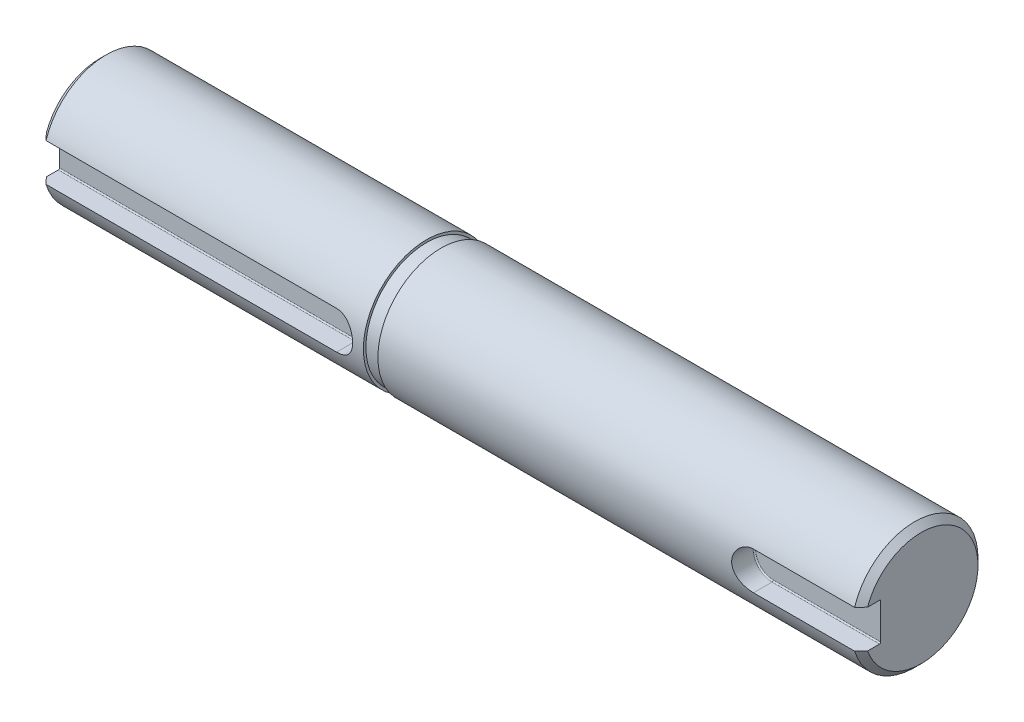
ISO-10303-21;
HEADER;
FILE_DESCRIPTION(('STEP AP214'),'2;1');
FILE_NAME('part.step','',(''),(''),'','','');
FILE_SCHEMA(('AUTOMOTIVE_DESIGN { 1 0 10303 214 1 1 1 1 }'));
ENDSEC;
DATA;
#1=APPLICATION_CONTEXT('core data for automotive mechanical design processes');
#2=APPLICATION_PROTOCOL_DEFINITION('international standard','automotive_design',2000,#1);
#3=PRODUCT_CONTEXT('',#1,'mechanical');
#4=PRODUCT('Part','Part','',(#3));
#5=PRODUCT_RELATED_PRODUCT_CATEGORY('part','',(#4));
#6=PRODUCT_DEFINITION_FORMATION('','',#4);
#7=PRODUCT_DEFINITION_CONTEXT('part definition',#1,'design');
#8=PRODUCT_DEFINITION('design','',#6,#7);
#9=PRODUCT_DEFINITION_SHAPE('','',#8);
#10=(LENGTH_UNIT() NAMED_UNIT(*) SI_UNIT(.MILLI.,.METRE.));
#11=(NAMED_UNIT(*) PLANE_ANGLE_UNIT() SI_UNIT($,.RADIAN.));
#12=(NAMED_UNIT(*) SI_UNIT($,.STERADIAN.) SOLID_ANGLE_UNIT());
#13=UNCERTAINTY_MEASURE_WITH_UNIT(LENGTH_MEASURE(1.E-05),#10,'distance_accuracy_value','');
#14=(GEOMETRIC_REPRESENTATION_CONTEXT(3) GLOBAL_UNCERTAINTY_ASSIGNED_CONTEXT((#13)) GLOBAL_UNIT_ASSIGNED_CONTEXT((#10,
#11,#12)) REPRESENTATION_CONTEXT('',''));
#15=CARTESIAN_POINT('',(0.,0.,0.));
#16=DIRECTION('',(0.,0.,1.));
#17=DIRECTION('',(1.,0.,0.));
#18=AXIS2_PLACEMENT_3D('',#15,#16,#17);
#19=CARTESIAN_POINT('',(0.,0.,0.));
#20=DIRECTION('',(-1.,0.,0.));
#21=DIRECTION('',(0.,0.,1.));
#22=AXIS2_PLACEMENT_3D('',#19,#20,#21);
#23=CYLINDRICAL_SURFACE('',#22,5.);
#24=CARTESIAN_POINT('',(25.,0.,5.));
#25=CARTESIAN_POINT('',(24.9999990025151,-0.0822886127532997,4.9999992925055));
#26=CARTESIAN_POINT('',(24.993206136376,-0.164587318351529,4.99794915693953));
#27=CARTESIAN_POINT('',(24.9662786457779,-0.32678812530488,4.98997105593691));
#28=CARTESIAN_POINT('',(24.9461400419767,-0.406689504411419,4.98404193389692));
#29=CARTESIAN_POINT('',(24.8932539830897,-0.561732707754524,4.96895552501836));
#30=CARTESIAN_POINT('',(24.8605251303811,-0.63688136439537,4.95980300250425));
#31=CARTESIAN_POINT('',(24.7834639069442,-0.780624181053128,4.93922109237645));
#32=CARTESIAN_POINT('',(24.7391299926046,-0.849217467469666,4.92779140192067));
#33=CARTESIAN_POINT('',(24.6387759925273,-0.979871797183741,4.90350737192774));
#34=CARTESIAN_POINT('',(24.5824833741141,-1.04171807124434,4.89062383657036));
#35=CARTESIAN_POINT('',(24.4603907700898,-1.15524920923323,4.86505834210442));
#36=CARTESIAN_POINT('',(24.394589187875,-1.2069323632744,4.85237641724501));
#37=CARTESIAN_POINT('',(24.2535292469624,-1.29980037723707,4.82834113993772));
#38=CARTESIAN_POINT('',(24.1780915390093,-1.34072309022213,4.81702406663875));
#39=CARTESIAN_POINT('',(24.0210107457697,-1.4092139477476,4.79743620394031));
#40=CARTESIAN_POINT('',(23.939369156072,-1.43678529919973,4.78916468313311));
#41=CARTESIAN_POINT('',(23.7746097338695,-1.47701633682651,4.77690870838434));
#42=CARTESIAN_POINT('',(23.6915972561361,-1.49007196234677,4.77281069324533));
#43=CARTESIAN_POINT('',(23.5244668437832,-1.50213730614671,4.76902789749767));
#44=CARTESIAN_POINT('',(23.4403491819409,-1.50115042761078,4.76934204760571));
#45=CARTESIAN_POINT('',(23.2766160913915,-1.48546977199811,4.77424744067778));
#46=CARTESIAN_POINT('',(23.1969477496378,-1.47127205262685,4.77868388599141));
#47=CARTESIAN_POINT('',(23.0411802137265,-1.43037420427055,4.79108356228624));
#48=CARTESIAN_POINT('',(22.9650813726257,-1.4036728414164,4.79904714132351));
#49=CARTESIAN_POINT('',(22.8173996503393,-1.33816026653681,4.81772733074973));
#50=CARTESIAN_POINT('',(22.7458929160447,-1.29918816934642,4.82848016115952));
#51=CARTESIAN_POINT('',(22.6102679779898,-1.21035222588683,4.85150987000065));
#52=CARTESIAN_POINT('',(22.5461515705862,-1.16048574002588,4.86378711746991));
#53=CARTESIAN_POINT('',(22.424313809238,-1.04881290765546,4.88911011297937));
#54=CARTESIAN_POINT('',(22.3669713359703,-0.986594907466968,4.90216654310498));
#55=CARTESIAN_POINT('',(22.2634460159358,-0.853263259313963,4.92712244063259));
#56=CARTESIAN_POINT('',(22.2172638715856,-0.782149051860885,4.9390218351841));
#57=CARTESIAN_POINT('',(22.1371400775353,-0.632355038342801,4.9604316006947));
#58=CARTESIAN_POINT('',(22.1032824837501,-0.553627749747948,4.96992543668314));
#59=CARTESIAN_POINT('',(22.0494004099004,-0.391245415603517,4.98533521832222));
#60=CARTESIAN_POINT('',(22.0293720714675,-0.30759175158958,4.99125216186999));
#61=CARTESIAN_POINT('',(22.0043478221006,-0.14095224266833,4.99868364643538));
#62=CARTESIAN_POINT('',(21.9988384141984,-0.0580500976011853,5.0003485041779));
#63=CARTESIAN_POINT('',(22.0015691557121,0.107499605823385,4.99952923241759));
#64=CARTESIAN_POINT('',(22.0098074696514,0.190147196690782,4.99704565677756));
#65=CARTESIAN_POINT('',(22.0393846111115,0.350903605309698,4.98830696987163));
#66=CARTESIAN_POINT('',(22.0604233875809,0.42907277261417,4.98213829799417));
#67=CARTESIAN_POINT('',(22.1146432327782,0.580754638954523,4.96674347841532));
#68=CARTESIAN_POINT('',(22.1478257610379,0.654266777025585,4.95751696321085));
#69=CARTESIAN_POINT('',(22.2262531654811,0.796437189461053,4.93669654351325));
#70=CARTESIAN_POINT('',(22.271759340948,0.86494382619967,4.92505280829675));
#71=CARTESIAN_POINT('',(22.3732247540528,0.993523307980146,4.90073468764317));
#72=CARTESIAN_POINT('',(22.4291866118877,1.05359403235593,4.8880600443108));
#73=CARTESIAN_POINT('',(22.5523873083694,1.16585744551027,4.86253171869138));
#74=CARTESIAN_POINT('',(22.6199618757717,1.21768481231503,4.84968825033268));
#75=CARTESIAN_POINT('',(22.7631279390135,1.30928995072153,4.82576515238463));
#76=CARTESIAN_POINT('',(22.8387192245582,1.34906803829472,4.81468547654651));
#77=CARTESIAN_POINT('',(22.9955324912547,1.41517347127168,4.79567189615055));
#78=CARTESIAN_POINT('',(23.0767261865366,1.4415634693705,4.78772337843827));
#79=CARTESIAN_POINT('',(23.2426879689315,1.48021730815114,4.77591594362794));
#80=CARTESIAN_POINT('',(23.3274548207877,1.49248598978779,4.772055625083));
#81=CARTESIAN_POINT('',(23.4943615183762,1.50221984485059,4.76899972496087));
#82=CARTESIAN_POINT('',(23.5764636510176,1.5002805530849,4.76961647442754));
#83=CARTESIAN_POINT('',(23.7391141033728,1.48307505444813,4.77499401288294));
#84=CARTESIAN_POINT('',(23.8196624851764,1.46780938124716,4.77975463592551));
#85=CARTESIAN_POINT('',(23.9759453991429,1.42476888804136,4.79275763670386));
#86=CARTESIAN_POINT('',(24.0517272873617,1.39715175507068,4.80095604545965));
#87=CARTESIAN_POINT('',(24.1976424388177,1.33031507121129,4.81990278909136));
#88=CARTESIAN_POINT('',(24.2677746176408,1.29109329962876,4.83065161194312));
#89=CARTESIAN_POINT('',(24.4031631165271,1.20048763805072,4.85397676425833));
#90=CARTESIAN_POINT('',(24.4681487612604,1.14871276092994,4.86660540163797));
#91=CARTESIAN_POINT('',(24.5887024983079,1.03517434629782,4.89201320450026));
#92=CARTESIAN_POINT('',(24.6442681394678,0.973408217134499,4.90479240823905));
#93=CARTESIAN_POINT('',(24.746023412295,0.839465762183246,4.92950936570649));
#94=CARTESIAN_POINT('',(24.7918914468555,0.767037885790605,4.94141159765674));
#95=CARTESIAN_POINT('',(24.870735169904,0.615141373983527,4.96260680455813));
#96=CARTESIAN_POINT('',(24.9037168882745,0.535676052998954,4.97190099931066));
#97=CARTESIAN_POINT('',(24.9528952756528,0.38075771265528,4.98602174969301));
#98=CARTESIAN_POINT('',(24.9705116728832,0.305786961954233,4.99122027381067));
#99=CARTESIAN_POINT('',(24.9940635252416,0.153880195230779,4.99820944494492));
#100=CARTESIAN_POINT('',(25.0000009327048,0.0769445098581395,5.0000006615474));
#101=CARTESIAN_POINT('',(25.,0.,5.));
#102=B_SPLINE_CURVE_WITH_KNOTS('',3,(#24,#25,#26,#27,#28,#29,#30,#31,#32,#33,#34,#35,#36,#37,
#38,#39,#40,#41,#42,#43,#44,#45,#46,#47,#48,#49,#50,#51,#52,#53,#54,#55,#56,#57,#58,#59,#60,#61,
#62,#63,#64,#65,#66,#67,#68,#69,#70,#71,#72,#73,#74,#75,#76,#77,#78,#79,#80,#81,#82,#83,#84,#85,
#86,#87,#88,#89,#90,#91,#92,#93,#94,#95,#96,#97,#98,#99,#100,#101),.UNSPECIFIED.,.T.,.F.,(4,2,2,
2,2,2,2,2,2,2,2,2,2,2,2,2,2,2,2,2,2,2,2,2,2,2,2,2,2,2,2,2,2,2,2,2,2,2,4),(0.,0.24658320361261,
0.493239964845998,0.739533676300871,0.985860164412698,1.23855602948191,1.49129437288632,
1.74971481004108,2.00807314543223,2.25919689356598,2.51025978319089,2.75226016697675,
2.99428443658001,3.23962426447119,3.48502360158555,3.74067104048166,3.9963345653107,
4.25371046881687,4.51101453528807,4.75908809438544,5.00712853550325,5.24956746682326,
5.49203554593727,5.74011305702907,5.9882528200019,6.24540400322817,6.50254844252679,
6.7584781495125,7.01432009460282,7.25950155466941,7.50467319661598,7.74680040402719,
7.98897397553105,8.23996925679929,8.491029748975,8.74942996156669,9.00770911595233,
9.23831691930457,9.46888616948872),.UNSPECIFIED.);
#103=CARTESIAN_POINT('',(23.5,1.5,4.76969600708473));
#104=VERTEX_POINT('',#103);
#105=CARTESIAN_POINT('',(23.5,-1.5,4.76969600708473));
#106=VERTEX_POINT('',#105);
#107=EDGE_CURVE('E278',#104,#106,#102,.T.);
#108=ORIENTED_EDGE('',*,*,#107,.T.);
#109=DIRECTION('',(-1.,0.,0.));
#110=VECTOR('',#109,1.);
#111=CARTESIAN_POINT('',(0.,-1.5,4.76969600708473));
#112=LINE('',#111,#110);
#113=CARTESIAN_POINT('',(0.499999999999999,-1.5,4.76969600708473));
#114=VERTEX_POINT('',#113);
#115=EDGE_CURVE('E233',#106,#114,#112,.T.);
#116=ORIENTED_EDGE('',*,*,#115,.T.);
#117=CARTESIAN_POINT('',(0.499999999999999,0.,0.));
#118=DIRECTION('',(1.,0.,0.));
#119=DIRECTION('',(0.,0.,-1.));
#120=AXIS2_PLACEMENT_3D('',#117,#118,#119);
#121=CIRCLE('',#120,5.);
#122=CARTESIAN_POINT('',(0.499999999999999,1.5,4.76969600708473));
#123=VERTEX_POINT('',#122);
#124=EDGE_CURVE('E242',#114,#123,#121,.T.);
#125=ORIENTED_EDGE('',*,*,#124,.T.);
#126=DIRECTION('',(-1.,0.,0.));
#127=VECTOR('',#126,1.);
#128=CARTESIAN_POINT('',(0.,1.5,4.76969600708473));
#129=LINE('',#128,#127);
#130=EDGE_CURVE('E68',#123,#104,#129,.F.);
#131=ORIENTED_EDGE('',*,*,#130,.T.);
#132=EDGE_LOOP('',(#108,#116,#125,#131));
#133=FACE_BOUND('',#132,.T.);
#134=CARTESIAN_POINT('',(25.85,0.,0.));
#135=DIRECTION('',(-1.,0.,0.));
#136=DIRECTION('',(0.,0.,1.));
#137=AXIS2_PLACEMENT_3D('',#134,#135,#136);
#138=CIRCLE('',#137,5.);
#139=CARTESIAN_POINT('',(25.85,0.,5.));
#140=VERTEX_POINT('',#139);
#141=EDGE_CURVE('E179',#140,#140,#138,.T.);
#142=ORIENTED_EDGE('',*,*,#141,.T.);
#143=EDGE_LOOP('',(#142));
#144=FACE_BOUND('',#143,.T.);
#145=ADVANCED_FACE('F39',(#133,#144),#23,.T.);
#146=CARTESIAN_POINT('',(0.,5.,0.));
#147=DIRECTION('',(1.,0.,0.));
#148=DIRECTION('',(0.,0.,-1.));
#149=AXIS2_PLACEMENT_3D('',#146,#147,#148);
#150=PLANE('',#149);
#151=CARTESIAN_POINT('',(0.,1.4,3.3));
#152=DIRECTION('',(-1.,0.,0.));
#153=DIRECTION('',(0.,-1.,0.));
#154=AXIS2_PLACEMENT_3D('',#151,#152,#153);
#155=CIRCLE('',#154,0.1);
#156=CARTESIAN_POINT('',(0.,1.5,3.3));
#157=VERTEX_POINT('',#156);
#158=CARTESIAN_POINT('',(0.,1.4,3.2));
#159=VERTEX_POINT('',#158);
#160=EDGE_CURVE('E229',#157,#159,#155,.T.);
#161=ORIENTED_EDGE('',*,*,#160,.F.);
#162=DIRECTION('',(0.,0.,1.));
#163=VECTOR('',#162,1.);
#164=CARTESIAN_POINT('',(0.,1.5,3.2));
#165=LINE('',#164,#163);
#166=CARTESIAN_POINT('',(0.,1.5,4.2426406871193));
#167=VERTEX_POINT('',#166);
#168=EDGE_CURVE('E198',#157,#167,#165,.T.);
#169=ORIENTED_EDGE('',*,*,#168,.T.);
#170=CARTESIAN_POINT('',(0.,0.,0.));
#171=DIRECTION('',(1.,0.,0.));
#172=DIRECTION('',(0.,0.,-1.));
#173=AXIS2_PLACEMENT_3D('',#170,#171,#172);
#174=CIRCLE('',#173,4.50000000000001);
#175=CARTESIAN_POINT('',(0.,-1.5,4.2426406871193));
#176=VERTEX_POINT('',#175);
#177=EDGE_CURVE('E236',#167,#176,#174,.F.);
#178=ORIENTED_EDGE('',*,*,#177,.T.);
#179=DIRECTION('',(0.,0.,1.));
#180=VECTOR('',#179,1.);
#181=CARTESIAN_POINT('',(0.,-1.5,3.2));
#182=LINE('',#181,#180);
#183=CARTESIAN_POINT('',(0.,-1.5,3.3));
#184=VERTEX_POINT('',#183);
#185=EDGE_CURVE('E195',#184,#176,#182,.T.);
#186=ORIENTED_EDGE('',*,*,#185,.F.);
#187=CARTESIAN_POINT('',(0.,-1.4,3.3));
#188=DIRECTION('',(-1.,0.,0.));
#189=DIRECTION('',(0.,-1.,0.));
#190=AXIS2_PLACEMENT_3D('',#187,#188,#189);
#191=CIRCLE('',#190,0.1);
#192=CARTESIAN_POINT('',(0.,-1.4,3.2));
#193=VERTEX_POINT('',#192);
#194=EDGE_CURVE('E221',#184,#193,#191,.F.);
#195=ORIENTED_EDGE('',*,*,#194,.T.);
#196=DIRECTION('',(0.,-1.,0.));
#197=VECTOR('',#196,1.);
#198=CARTESIAN_POINT('',(0.,0.,3.2));
#199=LINE('',#198,#197);
#200=EDGE_CURVE('E206',#159,#193,#199,.T.);
#201=ORIENTED_EDGE('',*,*,#200,.F.);
#202=EDGE_LOOP('',(#161,#169,#178,#186,#195,#201));
#203=FACE_BOUND('',#202,.T.);
#204=ADVANCED_FACE('F291',(#203),#150,.F.);
#205=CARTESIAN_POINT('',(0.,0.,0.));
#206=DIRECTION('',(1.,0.,0.));
#207=DIRECTION('',(0.,0.,-1.));
#208=AXIS2_PLACEMENT_3D('',#205,#206,#207);
#209=CONICAL_SURFACE('',#208,4.50000000000001,0.785398163397438);
#210=CARTESIAN_POINT('',(-2.09064328129567,-1.5,1.88547070991992));
#211=CARTESIAN_POINT('',(-2.01792213967263,-1.5,1.97831125879688));
#212=CARTESIAN_POINT('',(-1.94400679445829,-1.5,2.07019661899435));
#213=CARTESIAN_POINT('',(-1.79432989797205,-1.5,2.25242998527392));
#214=CARTESIAN_POINT('',(-1.71856863716365,-1.5,2.34277822947703));
#215=CARTESIAN_POINT('',(-1.56574550539014,-1.5,2.52230808443306));
#216=CARTESIAN_POINT('',(-1.48868409392483,-1.5,2.61149008836681));
#217=CARTESIAN_POINT('',(-1.33353885371558,-1.5,2.78896631004598));
#218=CARTESIAN_POINT('',(-1.25545497910626,-1.5,2.87726048764928));
#219=CARTESIAN_POINT('',(-1.02011908128654,-1.5,3.14100497574606));
#220=CARTESIAN_POINT('',(-0.861700309074557,-1.5,3.31541303599295));
#221=CARTESIAN_POINT('',(-0.54288723558407,-1.5,3.66242977966644));
#222=CARTESIAN_POINT('',(-0.382492786094846,-1.5,3.83503832628211));
#223=CARTESIAN_POINT('',(-0.155099679438291,-1.5,4.07783857242075));
#224=CARTESIAN_POINT('',(-0.0886584214187506,-1.5,4.14855325256216));
#225=CARTESIAN_POINT('',(0.044426276609358,-1.5,4.28979835668245));
#226=CARTESIAN_POINT('',(0.111069725914261,-1.5,4.360328771903));
#227=CARTESIAN_POINT('',(0.373124943367427,-1.5,4.63699711310972));
#228=CARTESIAN_POINT('',(0.569181714619836,-1.5,4.84252415192619));
#229=CARTESIAN_POINT('',(0.962293748240132,-1.5,5.25262198002303));
#230=CARTESIAN_POINT('',(1.15934901732717,-1.5,5.45719276285064));
#231=CARTESIAN_POINT('',(1.55412683072632,-1.5,5.86559472239559));
#232=CARTESIAN_POINT('',(1.7518492047509,-1.5,6.06942606381641));
#233=CARTESIAN_POINT('',(2.14783110480794,-1.5,6.47655943334496));
#234=CARTESIAN_POINT('',(2.34609062125706,-1.5,6.67986147077094));
#235=CARTESIAN_POINT('',(2.54453379410456,-1.5,6.8829831015542));
#236=B_SPLINE_CURVE_WITH_KNOTS('',3,(#210,#211,#212,#213,#214,#215,#216,#217,#218,#219,#220,
#221,#222,#223,#224,#225,#226,#227,#228,#229,#230,#231,#232,#233,#234,#235),.UNSPECIFIED.,.F.,
.F.,(4,2,2,2,2,2,2,2,2,2,2,2,4),(0.,0.353760942374931,0.707466573792519,1.06104971356888,
1.4146487689915,2.12146772421686,2.82834003025904,3.11943260912062,3.41053878102105,
4.2626576694719,5.1147822996858,5.96670377266865,6.81861014502524),.UNSPECIFIED.);
#237=EDGE_CURVE('E254',#176,#114,#236,.T.);
#238=ORIENTED_EDGE('',*,*,#237,.F.);
#239=ORIENTED_EDGE('',*,*,#177,.F.);
#240=CARTESIAN_POINT('',(2.54453379410456,1.5,6.8829831015542));
#241=CARTESIAN_POINT('',(2.34601980929173,1.5,6.67978950434198));
#242=CARTESIAN_POINT('',(2.14769007664002,1.5,6.47641507149926));
#243=CARTESIAN_POINT('',(1.75158093835413,1.5,6.06914959144309));
#244=CARTESIAN_POINT('',(1.55380150747332,1.5,5.8652585687778));
#245=CARTESIAN_POINT('',(1.15903627299562,1.5,5.45686883198162));
#246=CARTESIAN_POINT('',(0.962050180166844,1.5,5.25237039771848));
#247=CARTESIAN_POINT('',(0.569067971913482,1.5,4.8424029795565));
#248=CARTESIAN_POINT('',(0.373071909858402,1.5,4.63693394446694));
#249=CARTESIAN_POINT('',(-0.0175923249112521,1.5,4.22449925316428));
#250=CARTESIAN_POINT('',(-0.212259629943742,1.5,4.01753277263557));
#251=CARTESIAN_POINT('',(-0.502562773828023,1.5,3.70552768407944));
#252=CARTESIAN_POINT('',(-0.59904133053563,1.5,3.601273557372));
#253=CARTESIAN_POINT('',(-0.791277646732076,1.5,3.39209796630617));
#254=CARTESIAN_POINT('',(-0.8870353906622,1.5,3.28717648763268));
#255=CARTESIAN_POINT('',(-1.07766439761342,1.5,3.07642697830786));
#256=CARTESIAN_POINT('',(-1.17253515526146,1.5,2.97059848971517));
#257=CARTESIAN_POINT('',(-1.3610167898763,1.5,2.75783501804455));
#258=CARTESIAN_POINT('',(-1.45462774242787,1.5,2.6509001020362));
#259=CARTESIAN_POINT('',(-1.64016981739377,1.5,2.43549507246028));
#260=CARTESIAN_POINT('',(-1.73210020080093,1.5,2.32702431904529));
#261=CARTESIAN_POINT('',(-1.86815014271196,1.5,2.16276920050959));
#262=CARTESIAN_POINT('',(-1.91319702169462,1.5,2.10775363485132));
#263=CARTESIAN_POINT('',(-2.00252885267306,1.5,1.99710243867553));
#264=CARTESIAN_POINT('',(-2.04681375890613,1.5,1.9414667712442));
#265=CARTESIAN_POINT('',(-2.09064328129567,1.5,1.88547070991992));
#266=B_SPLINE_CURVE_WITH_KNOTS('',3,(#240,#241,#242,#243,#244,#245,#246,#247,#248,#249,#250,
#251,#252,#253,#254,#255,#256,#257,#258,#259,#260,#261,#262,#263,#264,#265),.UNSPECIFIED.,.F.,
.F.,(4,2,2,2,2,2,2,2,2,2,2,2,4),(0.,0.85220903950296,1.70437831468502,2.55620212008201,
3.4080713648407,4.26045194363133,4.68658707934533,5.11273138694524,5.53910527446827,
5.96545346567756,6.39198483439893,6.60529406984002,6.81861607184101),.UNSPECIFIED.);
#267=EDGE_CURVE('E248',#123,#167,#266,.T.);
#268=ORIENTED_EDGE('',*,*,#267,.F.);
#269=ORIENTED_EDGE('',*,*,#124,.F.);
#270=EDGE_LOOP('',(#238,#239,#268,#269));
#271=FACE_BOUND('',#270,.T.);
#272=ADVANCED_FACE('F260',(#271),#209,.T.);
#273=CARTESIAN_POINT('',(23.5,0.,5.));
#274=DIRECTION('',(0.,0.,1.));
#275=DIRECTION('',(1.,0.,0.));
#276=AXIS2_PLACEMENT_3D('',#273,#274,#275);
#277=CYLINDRICAL_SURFACE('',#276,1.5);
#278=ORIENTED_EDGE('',*,*,#107,.F.);
#279=DIRECTION('',(0.,0.,1.));
#280=VECTOR('',#279,1.);
#281=CARTESIAN_POINT('',(23.5,1.5,3.2));
#282=LINE('',#281,#280);
#283=CARTESIAN_POINT('',(23.5,1.5,3.3));
#284=VERTEX_POINT('',#283);
#285=EDGE_CURVE('E197',#104,#284,#282,.F.);
#286=ORIENTED_EDGE('',*,*,#285,.T.);
#287=CARTESIAN_POINT('',(23.5,0.,3.3));
#288=DIRECTION('',(0.,0.,1.));
#289=DIRECTION('',(1.,0.,0.));
#290=AXIS2_PLACEMENT_3D('',#287,#288,#289);
#291=CIRCLE('',#290,1.5);
#292=CARTESIAN_POINT('',(23.5,-1.5,3.3));
#293=VERTEX_POINT('',#292);
#294=EDGE_CURVE('E216',#293,#284,#291,.T.);
#295=ORIENTED_EDGE('',*,*,#294,.F.);
#296=DIRECTION('',(0.,0.,1.));
#297=VECTOR('',#296,1.);
#298=CARTESIAN_POINT('',(23.5,-1.5,3.2));
#299=LINE('',#298,#297);
#300=EDGE_CURVE('E203',#293,#106,#299,.T.);
#301=ORIENTED_EDGE('',*,*,#300,.T.);
#302=EDGE_LOOP('',(#278,#286,#295,#301));
#303=FACE_BOUND('',#302,.T.);
#304=ADVANCED_FACE('F271',(#303),#277,.F.);
#305=CARTESIAN_POINT('',(0.,-1.5,3.2));
#306=DIRECTION('',(0.,-1.,0.));
#307=DIRECTION('',(1.,0.,0.));
#308=AXIS2_PLACEMENT_3D('',#305,#306,#307);
#309=PLANE('',#308);
#310=ORIENTED_EDGE('',*,*,#300,.F.);
#311=DIRECTION('',(1.,0.,0.));
#312=VECTOR('',#311,1.);
#313=CARTESIAN_POINT('',(23.5,-1.5,3.3));
#314=LINE('',#313,#312);
#315=EDGE_CURVE('E214',#184,#293,#314,.T.);
#316=ORIENTED_EDGE('',*,*,#315,.F.);
#317=ORIENTED_EDGE('',*,*,#185,.T.);
#318=ORIENTED_EDGE('',*,*,#237,.T.);
#319=ORIENTED_EDGE('',*,*,#115,.F.);
#320=EDGE_LOOP('',(#310,#316,#317,#318,#319));
#321=FACE_BOUND('',#320,.T.);
#322=ADVANCED_FACE('F268',(#321),#309,.F.);
#323=CARTESIAN_POINT('',(0.,1.5,3.2));
#324=DIRECTION('',(0.,1.,0.));
#325=DIRECTION('',(-1.,0.,0.));
#326=AXIS2_PLACEMENT_3D('',#323,#324,#325);
#327=PLANE('',#326);
#328=ORIENTED_EDGE('',*,*,#267,.T.);
#329=ORIENTED_EDGE('',*,*,#168,.F.);
#330=DIRECTION('',(-1.,0.,0.));
#331=VECTOR('',#330,1.);
#332=CARTESIAN_POINT('',(0.,1.5,3.3));
#333=LINE('',#332,#331);
#334=EDGE_CURVE('E219',#284,#157,#333,.T.);
#335=ORIENTED_EDGE('',*,*,#334,.F.);
#336=ORIENTED_EDGE('',*,*,#285,.F.);
#337=ORIENTED_EDGE('',*,*,#130,.F.);
#338=EDGE_LOOP('',(#328,#329,#335,#336,#337));
#339=FACE_BOUND('',#338,.T.);
#340=ADVANCED_FACE('F263',(#339),#327,.F.);
#341=CARTESIAN_POINT('',(0.,0.,3.2));
#342=DIRECTION('',(0.,0.,1.));
#343=DIRECTION('',(1.,0.,0.));
#344=AXIS2_PLACEMENT_3D('',#341,#342,#343);
#345=PLANE('',#344);
#346=DIRECTION('',(1.,0.,0.));
#347=VECTOR('',#346,1.);
#348=CARTESIAN_POINT('',(0.,-1.4,3.2));
#349=LINE('',#348,#347);
#350=CARTESIAN_POINT('',(23.5,-1.4,3.2));
#351=VERTEX_POINT('',#350);
#352=EDGE_CURVE('E211',#351,#193,#349,.F.);
#353=ORIENTED_EDGE('',*,*,#352,.F.);
#354=CARTESIAN_POINT('',(23.5,0.,3.2));
#355=DIRECTION('',(0.,0.,1.));
#356=DIRECTION('',(1.,0.,0.));
#357=AXIS2_PLACEMENT_3D('',#354,#355,#356);
#358=CIRCLE('',#357,1.4);
#359=CARTESIAN_POINT('',(23.5,1.4,3.2));
#360=VERTEX_POINT('',#359);
#361=EDGE_CURVE('E209',#360,#351,#358,.F.);
#362=ORIENTED_EDGE('',*,*,#361,.F.);
#363=DIRECTION('',(-1.,0.,0.));
#364=VECTOR('',#363,1.);
#365=CARTESIAN_POINT('',(23.5,1.4,3.2));
#366=LINE('',#365,#364);
#367=EDGE_CURVE('E207',#159,#360,#366,.F.);
#368=ORIENTED_EDGE('',*,*,#367,.F.);
#369=ORIENTED_EDGE('',*,*,#200,.T.);
#370=EDGE_LOOP('',(#353,#362,#368,#369));
#371=FACE_BOUND('',#370,.T.);
#372=ADVANCED_FACE('F267',(#371),#345,.T.);
#373=CARTESIAN_POINT('',(23.5,0.,3.3));
#374=DIRECTION('',(0.,0.,1.));
#375=DIRECTION('',(1.,0.,0.));
#376=AXIS2_PLACEMENT_3D('',#373,#374,#375);
#377=TOROIDAL_SURFACE('',#376,1.4,0.1);
#378=CARTESIAN_POINT('',(23.5,-1.4,3.3));
#379=DIRECTION('',(-1.,0.,0.));
#380=DIRECTION('',(0.,0.,1.));
#381=AXIS2_PLACEMENT_3D('',#378,#379,#380);
#382=CIRCLE('',#381,0.1);
#383=EDGE_CURVE('E194',#351,#293,#382,.T.);
#384=ORIENTED_EDGE('',*,*,#383,.T.);
#385=ORIENTED_EDGE('',*,*,#294,.T.);
#386=CARTESIAN_POINT('',(23.5,1.4,3.3));
#387=DIRECTION('',(-1.,0.,0.));
#388=DIRECTION('',(0.,0.,1.));
#389=AXIS2_PLACEMENT_3D('',#386,#387,#388);
#390=CIRCLE('',#389,0.1);
#391=EDGE_CURVE('E201',#284,#360,#390,.T.);
#392=ORIENTED_EDGE('',*,*,#391,.T.);
#393=ORIENTED_EDGE('',*,*,#361,.T.);
#394=EDGE_LOOP('',(#384,#385,#392,#393));
#395=FACE_BOUND('',#394,.T.);
#396=ADVANCED_FACE('F324',(#395),#377,.F.);
#397=CARTESIAN_POINT('',(0.,1.4,3.3));
#398=DIRECTION('',(1.,0.,0.));
#399=DIRECTION('',(0.,1.,0.));
#400=AXIS2_PLACEMENT_3D('',#397,#398,#399);
#401=CYLINDRICAL_SURFACE('',#400,0.1);
#402=ORIENTED_EDGE('',*,*,#391,.F.);
#403=ORIENTED_EDGE('',*,*,#334,.T.);
#404=ORIENTED_EDGE('',*,*,#160,.T.);
#405=ORIENTED_EDGE('',*,*,#367,.T.);
#406=EDGE_LOOP('',(#402,#403,#404,#405));
#407=FACE_BOUND('',#406,.T.);
#408=ADVANCED_FACE('F311',(#407),#401,.F.);
#409=CARTESIAN_POINT('',(0.,-1.4,3.3));
#410=DIRECTION('',(-1.,0.,0.));
#411=DIRECTION('',(0.,-1.,0.));
#412=AXIS2_PLACEMENT_3D('',#409,#410,#411);
#413=CYLINDRICAL_SURFACE('',#412,0.1);
#414=ORIENTED_EDGE('',*,*,#383,.F.);
#415=ORIENTED_EDGE('',*,*,#352,.T.);
#416=ORIENTED_EDGE('',*,*,#194,.F.);
#417=ORIENTED_EDGE('',*,*,#315,.T.);
#418=EDGE_LOOP('',(#414,#415,#416,#417));
#419=FACE_BOUND('',#418,.T.);
#420=ADVANCED_FACE('F276',(#419),#413,.F.);
#421=CARTESIAN_POINT('',(25.85,4.8,0.));
#422=DIRECTION('',(1.,0.,0.));
#423=DIRECTION('',(0.,0.,-1.));
#424=AXIS2_PLACEMENT_3D('',#421,#422,#423);
#425=PLANE('',#424);
#426=CARTESIAN_POINT('',(25.85,0.,0.));
#427=DIRECTION('',(-1.,0.,0.));
#428=DIRECTION('',(0.,0.,1.));
#429=AXIS2_PLACEMENT_3D('',#426,#427,#428);
#430=CIRCLE('',#429,4.8);
#431=CARTESIAN_POINT('',(25.85,0.,4.8));
#432=VERTEX_POINT('',#431);
#433=EDGE_CURVE('E566',#432,#432,#430,.T.);
#434=ORIENTED_EDGE('',*,*,#433,.T.);
#435=EDGE_LOOP('',(#434));
#436=FACE_BOUND('',#435,.T.);
#437=ORIENTED_EDGE('',*,*,#141,.F.);
#438=EDGE_LOOP('',(#437));
#439=FACE_BOUND('',#438,.T.);
#440=ADVANCED_FACE('F338',(#436,#439),#425,.T.);
#441=CARTESIAN_POINT('',(27.,4.8,0.));
#442=DIRECTION('',(-1.,0.,0.));
#443=DIRECTION('',(0.,0.,1.));
#444=AXIS2_PLACEMENT_3D('',#441,#442,#443);
#445=PLANE('',#444);
#446=CARTESIAN_POINT('',(27.,0.,0.));
#447=DIRECTION('',(-1.,0.,0.));
#448=DIRECTION('',(0.,0.,1.));
#449=AXIS2_PLACEMENT_3D('',#446,#447,#448);
#450=CIRCLE('',#449,5.);
#451=CARTESIAN_POINT('',(27.,0.,5.));
#452=VERTEX_POINT('',#451);
#453=EDGE_CURVE('E568',#452,#452,#450,.T.);
#454=ORIENTED_EDGE('',*,*,#453,.T.);
#455=EDGE_LOOP('',(#454));
#456=FACE_BOUND('',#455,.T.);
#457=CARTESIAN_POINT('',(27.,0.,0.));
#458=DIRECTION('',(-1.,0.,0.));
#459=DIRECTION('',(0.,0.,1.));
#460=AXIS2_PLACEMENT_3D('',#457,#458,#459);
#461=CIRCLE('',#460,4.8);
#462=CARTESIAN_POINT('',(27.,0.,4.8));
#463=VERTEX_POINT('',#462);
#464=EDGE_CURVE('E564',#463,#463,#461,.T.);
#465=ORIENTED_EDGE('',*,*,#464,.F.);
#466=EDGE_LOOP('',(#465));
#467=FACE_BOUND('',#466,.T.);
#468=ADVANCED_FACE('F342',(#456,#467),#445,.T.);
#469=CARTESIAN_POINT('',(0.,0.,0.));
#470=DIRECTION('',(-1.,0.,0.));
#471=DIRECTION('',(0.,0.,1.));
#472=AXIS2_PLACEMENT_3D('',#469,#470,#471);
#473=CYLINDRICAL_SURFACE('',#472,4.8);
#474=ORIENTED_EDGE('',*,*,#464,.T.);
#475=EDGE_LOOP('',(#474));
#476=FACE_BOUND('',#475,.T.);
#477=ORIENTED_EDGE('',*,*,#433,.F.);
#478=EDGE_LOOP('',(#477));
#479=FACE_BOUND('',#478,.T.);
#480=ADVANCED_FACE('F348',(#476,#479),#473,.T.);
#481=CARTESIAN_POINT('',(0.,0.,3.2));
#482=DIRECTION('',(0.,0.,1.));
#483=DIRECTION('',(1.,0.,0.));
#484=AXIS2_PLACEMENT_3D('',#481,#482,#483);
#485=PLANE('',#484);
#486=DIRECTION('',(-1.,0.,0.));
#487=VECTOR('',#486,1.);
#488=CARTESIAN_POINT('',(65.,1.4,3.2));
#489=LINE('',#488,#487);
#490=CARTESIAN_POINT('',(56.5,1.4,3.2));
#491=VERTEX_POINT('',#490);
#492=CARTESIAN_POINT('',(65.,1.4,3.2));
#493=VERTEX_POINT('',#492);
#494=EDGE_CURVE('E164',#491,#493,#489,.F.);
#495=ORIENTED_EDGE('',*,*,#494,.F.);
#496=CARTESIAN_POINT('',(56.5,0.,3.2));
#497=DIRECTION('',(0.,0.,1.));
#498=DIRECTION('',(1.,0.,0.));
#499=AXIS2_PLACEMENT_3D('',#496,#497,#498);
#500=CIRCLE('',#499,1.4);
#501=CARTESIAN_POINT('',(56.5,-1.4,3.2));
#502=VERTEX_POINT('',#501);
#503=EDGE_CURVE('E158',#502,#491,#500,.F.);
#504=ORIENTED_EDGE('',*,*,#503,.F.);
#505=DIRECTION('',(1.,0.,0.));
#506=VECTOR('',#505,1.);
#507=CARTESIAN_POINT('',(56.5,-1.4,3.2));
#508=LINE('',#507,#506);
#509=CARTESIAN_POINT('',(65.,-1.4,3.2));
#510=VERTEX_POINT('',#509);
#511=EDGE_CURVE('E148',#510,#502,#508,.F.);
#512=ORIENTED_EDGE('',*,*,#511,.F.);
#513=DIRECTION('',(0.,1.,0.));
#514=VECTOR('',#513,1.);
#515=CARTESIAN_POINT('',(65.,0.,3.2));
#516=LINE('',#515,#514);
#517=EDGE_CURVE('E159',#510,#493,#516,.T.);
#518=ORIENTED_EDGE('',*,*,#517,.T.);
#519=EDGE_LOOP('',(#495,#504,#512,#518));
#520=FACE_BOUND('',#519,.T.);
#521=ADVANCED_FACE('F162',(#520),#485,.T.);
#522=CARTESIAN_POINT('',(55.,1.4,3.3));
#523=DIRECTION('',(1.,0.,0.));
#524=DIRECTION('',(0.,1.,0.));
#525=AXIS2_PLACEMENT_3D('',#522,#523,#524);
#526=CYLINDRICAL_SURFACE('',#525,0.1);
#527=CARTESIAN_POINT('',(56.5,1.4,3.3));
#528=DIRECTION('',(1.,0.,0.));
#529=DIRECTION('',(0.,0.,-1.));
#530=AXIS2_PLACEMENT_3D('',#527,#528,#529);
#531=CIRCLE('',#530,0.1);
#532=CARTESIAN_POINT('',(56.5,1.5,3.3));
#533=VERTEX_POINT('',#532);
#534=EDGE_CURVE('E174',#491,#533,#531,.T.);
#535=ORIENTED_EDGE('',*,*,#534,.F.);
#536=ORIENTED_EDGE('',*,*,#494,.T.);
#537=CARTESIAN_POINT('',(65.,1.4,3.3));
#538=DIRECTION('',(1.,0.,0.));
#539=DIRECTION('',(0.,0.,-1.));
#540=AXIS2_PLACEMENT_3D('',#537,#538,#539);
#541=CIRCLE('',#540,0.1);
#542=CARTESIAN_POINT('',(65.,1.5,3.3));
#543=VERTEX_POINT('',#542);
#544=EDGE_CURVE('E185',#543,#493,#541,.F.);
#545=ORIENTED_EDGE('',*,*,#544,.F.);
#546=DIRECTION('',(-1.,0.,0.));
#547=VECTOR('',#546,1.);
#548=CARTESIAN_POINT('',(56.5,1.5,3.3));
#549=LINE('',#548,#547);
#550=EDGE_CURVE('E383',#543,#533,#549,.T.);
#551=ORIENTED_EDGE('',*,*,#550,.T.);
#552=EDGE_LOOP('',(#535,#536,#545,#551));
#553=FACE_BOUND('',#552,.T.);
#554=ADVANCED_FACE('F386',(#553),#526,.F.);
#555=CARTESIAN_POINT('',(56.5,0.,3.3));
#556=DIRECTION('',(0.,0.,1.));
#557=DIRECTION('',(1.,0.,0.));
#558=AXIS2_PLACEMENT_3D('',#555,#556,#557);
#559=TOROIDAL_SURFACE('',#558,1.4,0.1);
#560=ORIENTED_EDGE('',*,*,#534,.T.);
#561=CARTESIAN_POINT('',(56.5,0.,3.3));
#562=DIRECTION('',(0.,0.,1.));
#563=DIRECTION('',(1.,0.,0.));
#564=AXIS2_PLACEMENT_3D('',#561,#562,#563);
#565=CIRCLE('',#564,1.5);
#566=CARTESIAN_POINT('',(56.5,-1.5,3.3));
#567=VERTEX_POINT('',#566);
#568=EDGE_CURVE('E172',#533,#567,#565,.T.);
#569=ORIENTED_EDGE('',*,*,#568,.T.);
#570=CARTESIAN_POINT('',(56.5,-1.4,3.3));
#571=DIRECTION('',(1.,0.,0.));
#572=DIRECTION('',(0.,0.,-1.));
#573=AXIS2_PLACEMENT_3D('',#570,#571,#572);
#574=CIRCLE('',#573,0.1);
#575=EDGE_CURVE('E152',#567,#502,#574,.T.);
#576=ORIENTED_EDGE('',*,*,#575,.T.);
#577=ORIENTED_EDGE('',*,*,#503,.T.);
#578=EDGE_LOOP('',(#560,#569,#576,#577));
#579=FACE_BOUND('',#578,.T.);
#580=ADVANCED_FACE('F170',(#579),#559,.F.);
#581=CARTESIAN_POINT('',(55.,-1.4,3.3));
#582=DIRECTION('',(-1.,0.,0.));
#583=DIRECTION('',(0.,-1.,0.));
#584=AXIS2_PLACEMENT_3D('',#581,#582,#583);
#585=CYLINDRICAL_SURFACE('',#584,0.1);
#586=ORIENTED_EDGE('',*,*,#575,.F.);
#587=DIRECTION('',(1.,0.,0.));
#588=VECTOR('',#587,1.);
#589=CARTESIAN_POINT('',(65.,-1.5,3.3));
#590=LINE('',#589,#588);
#591=CARTESIAN_POINT('',(65.,-1.5,3.3));
#592=VERTEX_POINT('',#591);
#593=EDGE_CURVE('E188',#567,#592,#590,.T.);
#594=ORIENTED_EDGE('',*,*,#593,.T.);
#595=CARTESIAN_POINT('',(65.,-1.4,3.3));
#596=DIRECTION('',(1.,0.,0.));
#597=DIRECTION('',(0.,0.,-1.));
#598=AXIS2_PLACEMENT_3D('',#595,#596,#597);
#599=CIRCLE('',#598,0.1);
#600=EDGE_CURVE('E155',#592,#510,#599,.T.);
#601=ORIENTED_EDGE('',*,*,#600,.T.);
#602=ORIENTED_EDGE('',*,*,#511,.T.);
#603=EDGE_LOOP('',(#586,#594,#601,#602));
#604=FACE_BOUND('',#603,.T.);
#605=ADVANCED_FACE('F150',(#604),#585,.F.);
#606=CARTESIAN_POINT('',(65.,0.,0.));
#607=DIRECTION('',(-1.,0.,0.));
#608=DIRECTION('',(0.,0.,1.));
#609=AXIS2_PLACEMENT_3D('',#606,#607,#608);
#610=PLANE('',#609);
#611=ORIENTED_EDGE('',*,*,#600,.F.);
#612=DIRECTION('',(0.,0.,1.));
#613=VECTOR('',#612,1.);
#614=CARTESIAN_POINT('',(65.,-1.5,3.2));
#615=LINE('',#614,#613);
#616=CARTESIAN_POINT('',(65.,-1.5,4.24264068711928));
#617=VERTEX_POINT('',#616);
#618=EDGE_CURVE('E173',#592,#617,#615,.T.);
#619=ORIENTED_EDGE('',*,*,#618,.T.);
#620=CARTESIAN_POINT('',(65.,0.,0.));
#621=DIRECTION('',(-1.,0.,0.));
#622=DIRECTION('',(0.,0.,1.));
#623=AXIS2_PLACEMENT_3D('',#620,#621,#622);
#624=CIRCLE('',#623,4.5);
#625=CARTESIAN_POINT('',(65.,1.5,4.24264068711928));
#626=VERTEX_POINT('',#625);
#627=EDGE_CURVE('E245',#617,#626,#624,.F.);
#628=ORIENTED_EDGE('',*,*,#627,.T.);
#629=DIRECTION('',(0.,0.,1.));
#630=VECTOR('',#629,1.);
#631=CARTESIAN_POINT('',(65.,1.5,3.2));
#632=LINE('',#631,#630);
#633=EDGE_CURVE('E177',#543,#626,#632,.T.);
#634=ORIENTED_EDGE('',*,*,#633,.F.);
#635=ORIENTED_EDGE('',*,*,#544,.T.);
#636=ORIENTED_EDGE('',*,*,#517,.F.);
#637=EDGE_LOOP('',(#611,#619,#628,#634,#635,#636));
#638=FACE_BOUND('',#637,.T.);
#639=ADVANCED_FACE('F295',(#638),#610,.F.);
#640=CARTESIAN_POINT('',(64.5,0.,0.));
#641=DIRECTION('',(-1.,0.,0.));
#642=DIRECTION('',(0.,0.,1.));
#643=AXIS2_PLACEMENT_3D('',#640,#641,#642);
#644=CONICAL_SURFACE('',#643,5.,0.785398163397436);
#645=CARTESIAN_POINT('',(67.0906432812957,1.5,1.8854707099199));
#646=CARTESIAN_POINT('',(67.0179221396726,1.5,1.97831125879686));
#647=CARTESIAN_POINT('',(66.9440067944583,1.5,2.07019661899433));
#648=CARTESIAN_POINT('',(66.7943298979721,1.5,2.2524299852739));
#649=CARTESIAN_POINT('',(66.7185686371637,1.5,2.342778229477));
#650=CARTESIAN_POINT('',(66.5657455053902,1.5,2.52230808443303));
#651=CARTESIAN_POINT('',(66.4886840939248,1.5,2.61149008836677));
#652=CARTESIAN_POINT('',(66.3335388537156,1.5,2.78896631004595));
#653=CARTESIAN_POINT('',(66.2554549791063,1.5,2.87726048764925));
#654=CARTESIAN_POINT('',(66.0201190812866,1.5,3.14100497574603));
#655=CARTESIAN_POINT('',(65.8617003090746,1.5,3.31541303599292));
#656=CARTESIAN_POINT('',(65.5428872355841,1.5,3.6624297796664));
#657=CARTESIAN_POINT('',(65.3824927860949,1.5,3.83503832628207));
#658=CARTESIAN_POINT('',(65.1550996794383,1.5,4.07783857242071));
#659=CARTESIAN_POINT('',(65.0886584214188,1.5,4.14855325256212));
#660=CARTESIAN_POINT('',(64.9555737233907,1.5,4.28979835668243));
#661=CARTESIAN_POINT('',(64.8889302740858,1.5,4.36032877190298));
#662=CARTESIAN_POINT('',(64.6268750566326,1.5,4.63699711310971));
#663=CARTESIAN_POINT('',(64.4308182853802,1.5,4.84252415192617));
#664=CARTESIAN_POINT('',(64.0377062517599,1.5,5.25262198002302));
#665=CARTESIAN_POINT('',(63.8406509826728,1.5,5.45719276285064));
#666=CARTESIAN_POINT('',(63.4458731692737,1.5,5.86559472239559));
#667=CARTESIAN_POINT('',(63.2481507952491,1.5,6.06942606381641));
#668=CARTESIAN_POINT('',(62.852168895192,1.5,6.47655943334497));
#669=CARTESIAN_POINT('',(62.6539093787429,1.5,6.67986147077094));
#670=CARTESIAN_POINT('',(62.4554662058954,1.5,6.8829831015542));
#671=B_SPLINE_CURVE_WITH_KNOTS('',3,(#645,#646,#647,#648,#649,#650,#651,#652,#653,#654,#655,
#656,#657,#658,#659,#660,#661,#662,#663,#664,#665,#666,#667,#668,#669,#670),.UNSPECIFIED.,.F.,
.F.,(4,2,2,2,2,2,2,2,2,2,2,2,4),(0.,0.353760942374931,0.707466573792507,1.06104971356887,
1.4146487689915,2.12146772421684,2.82834003025901,3.11943260912061,3.41053878102106,
4.26265766947192,5.11478229968582,5.9667037726687,6.81861014502528),.UNSPECIFIED.);
#672=CARTESIAN_POINT('',(64.5,1.5,4.76969600708473));
#673=VERTEX_POINT('',#672);
#674=EDGE_CURVE('E53',#626,#673,#671,.T.);
#675=ORIENTED_EDGE('',*,*,#674,.F.);
#676=ORIENTED_EDGE('',*,*,#627,.F.);
#677=CARTESIAN_POINT('',(62.4554662058954,-1.5,6.8829831015542));
#678=CARTESIAN_POINT('',(62.6539801907083,-1.5,6.67978950434198));
#679=CARTESIAN_POINT('',(62.85230992336,-1.5,6.47641507149926));
#680=CARTESIAN_POINT('',(63.2484190616459,-1.5,6.06914959144309));
#681=CARTESIAN_POINT('',(63.4461984925267,-1.5,5.8652585687778));
#682=CARTESIAN_POINT('',(63.8409637270044,-1.5,5.45686883198161));
#683=CARTESIAN_POINT('',(64.0379498198332,-1.5,5.25237039771847));
#684=CARTESIAN_POINT('',(64.4309320280865,-1.5,4.84240297955649));
#685=CARTESIAN_POINT('',(64.6269280901416,-1.5,4.63693394446692));
#686=CARTESIAN_POINT('',(65.0175923249112,-1.5,4.22449925316427));
#687=CARTESIAN_POINT('',(65.2122596299437,-1.5,4.01753277263557));
#688=CARTESIAN_POINT('',(65.502562773828,-1.5,3.70552768407943));
#689=CARTESIAN_POINT('',(65.5990413305356,-1.5,3.60127355737199));
#690=CARTESIAN_POINT('',(65.7912776467321,-1.5,3.39209796630615));
#691=CARTESIAN_POINT('',(65.8870353906622,-1.5,3.28717648763267));
#692=CARTESIAN_POINT('',(66.0776643976134,-1.5,3.07642697830784));
#693=CARTESIAN_POINT('',(66.1725351552615,-1.5,2.97059848971515));
#694=CARTESIAN_POINT('',(66.3610167898763,-1.5,2.75783501804452));
#695=CARTESIAN_POINT('',(66.4546277424279,-1.5,2.65090010203617));
#696=CARTESIAN_POINT('',(66.6401698173938,-1.5,2.43549507246026));
#697=CARTESIAN_POINT('',(66.7321002008009,-1.5,2.32702431904526));
#698=CARTESIAN_POINT('',(66.868150142712,-1.5,2.16276920050956));
#699=CARTESIAN_POINT('',(66.9131970216946,-1.5,2.10775363485129));
#700=CARTESIAN_POINT('',(67.0025288526731,-1.5,1.9971024386755));
#701=CARTESIAN_POINT('',(67.0468137589061,-1.5,1.94146677124417));
#702=CARTESIAN_POINT('',(67.0906432812957,-1.5,1.8854707099199));
#703=B_SPLINE_CURVE_WITH_KNOTS('',3,(#677,#678,#679,#680,#681,#682,#683,#684,#685,#686,#687,
#688,#689,#690,#691,#692,#693,#694,#695,#696,#697,#698,#699,#700,#701,#702),.UNSPECIFIED.,.F.,
.F.,(4,2,2,2,2,2,2,2,2,2,2,2,4),(0.,0.852209039502969,1.70437831468503,2.55620212008203,
3.40807136484073,4.26045194363134,4.68658707934535,5.11273138694527,5.53910527446832,
5.96545346567761,6.39198483439898,6.60529406984007,6.81861607184105),.UNSPECIFIED.);
#704=CARTESIAN_POINT('',(64.5,-1.5,4.76969600708473));
#705=VERTEX_POINT('',#704);
#706=EDGE_CURVE('E282',#705,#617,#703,.T.);
#707=ORIENTED_EDGE('',*,*,#706,.F.);
#708=CARTESIAN_POINT('',(64.5,0.,0.));
#709=DIRECTION('',(-1.,0.,0.));
#710=DIRECTION('',(0.,0.,1.));
#711=AXIS2_PLACEMENT_3D('',#708,#709,#710);
#712=CIRCLE('',#711,5.);
#713=EDGE_CURVE('E239',#673,#705,#712,.T.);
#714=ORIENTED_EDGE('',*,*,#713,.F.);
#715=EDGE_LOOP('',(#675,#676,#707,#714));
#716=FACE_BOUND('',#715,.T.);
#717=ADVANCED_FACE('F41',(#716),#644,.T.);
#718=CARTESIAN_POINT('',(55.,1.5,3.2));
#719=DIRECTION('',(0.,1.,0.));
#720=DIRECTION('',(-1.,0.,0.));
#721=AXIS2_PLACEMENT_3D('',#718,#719,#720);
#722=PLANE('',#721);
#723=DIRECTION('',(0.,0.,1.));
#724=VECTOR('',#723,1.);
#725=CARTESIAN_POINT('',(56.5,1.5,3.2));
#726=LINE('',#725,#724);
#727=CARTESIAN_POINT('',(56.5,1.5,4.76969600708473));
#728=VERTEX_POINT('',#727);
#729=EDGE_CURVE('E376',#533,#728,#726,.T.);
#730=ORIENTED_EDGE('',*,*,#729,.F.);
#731=ORIENTED_EDGE('',*,*,#550,.F.);
#732=ORIENTED_EDGE('',*,*,#633,.T.);
#733=ORIENTED_EDGE('',*,*,#674,.T.);
#734=DIRECTION('',(-1.,0.,0.));
#735=VECTOR('',#734,1.);
#736=CARTESIAN_POINT('',(0.,1.50000000000001,4.76969600708473));
#737=LINE('',#736,#735);
#738=EDGE_CURVE('E191',#728,#673,#737,.F.);
#739=ORIENTED_EDGE('',*,*,#738,.F.);
#740=EDGE_LOOP('',(#730,#731,#732,#733,#739));
#741=FACE_BOUND('',#740,.T.);
#742=ADVANCED_FACE('F355',(#741),#722,.F.);
#743=CARTESIAN_POINT('',(56.5,0.,3.2));
#744=DIRECTION('',(0.,0.,1.));
#745=DIRECTION('',(1.,0.,0.));
#746=AXIS2_PLACEMENT_3D('',#743,#744,#745);
#747=CYLINDRICAL_SURFACE('',#746,1.5);
#748=DIRECTION('',(0.,0.,1.));
#749=VECTOR('',#748,1.);
#750=CARTESIAN_POINT('',(56.5,-1.5,3.2));
#751=LINE('',#750,#749);
#752=CARTESIAN_POINT('',(56.5,-1.5,4.76969600708473));
#753=VERTEX_POINT('',#752);
#754=EDGE_CURVE('E184',#753,#567,#751,.F.);
#755=ORIENTED_EDGE('',*,*,#754,.T.);
#756=ORIENTED_EDGE('',*,*,#568,.F.);
#757=ORIENTED_EDGE('',*,*,#729,.T.);
#758=CARTESIAN_POINT('',(56.5,-1.5,4.76969600708473));
#759=CARTESIAN_POINT('',(56.458820607092,-1.5000008535707,4.76969249084934));
#760=CARTESIAN_POINT('',(56.4176619568739,-1.49830317083427,4.77022997000129));
#761=CARTESIAN_POINT('',(56.3356588379044,-1.49153785660316,4.77235095109999));
#762=CARTESIAN_POINT('',(56.2948143006051,-1.48647098275841,4.77393421787376));
#763=CARTESIAN_POINT('',(56.1734094590453,-1.46630203689311,4.78018490618873));
#764=CARTESIAN_POINT('',(56.0936936095836,-1.44623120413662,4.78635370384275));
#765=CARTESIAN_POINT('',(55.9389644216141,-1.39353102315626,4.80195952113208));
#766=CARTESIAN_POINT('',(55.8639494478019,-1.36090607068203,4.81139539670393));
#767=CARTESIAN_POINT('',(55.7204033184024,-1.28407841117655,4.83246571212052));
#768=CARTESIAN_POINT('',(55.6518752002716,-1.23987031651226,4.84410117434933));
#769=CARTESIAN_POINT('',(55.5211339440029,-1.13964850658326,4.86866835244721));
#770=CARTESIAN_POINT('',(55.4591563396566,-1.08333433465208,4.88162755412974));
#771=CARTESIAN_POINT('',(55.3453644161,-0.961138919873351,4.90714811559049));
#772=CARTESIAN_POINT('',(55.2935518139969,-0.895256063916345,4.91970940785249));
#773=CARTESIAN_POINT('',(55.2005362296815,-0.754109921315427,4.94333239727705));
#774=CARTESIAN_POINT('',(55.159574819702,-0.678680819336256,4.95435770971354));
#775=CARTESIAN_POINT('',(55.0910115883818,-0.521621185505771,4.97334469846208));
#776=CARTESIAN_POINT('',(55.0634063222057,-0.439992259012924,4.98130716463903));
#777=CARTESIAN_POINT('',(55.0231202008979,-0.275324697874875,4.99307639935002));
#778=CARTESIAN_POINT('',(55.0100351420303,-0.192393125294252,4.99699549276993));
#779=CARTESIAN_POINT('',(54.9978826586367,-0.0254235719980814,5.00063202022426));
#780=CARTESIAN_POINT('',(54.9988125802998,0.0586141962423619,5.00035024971471));
#781=CARTESIAN_POINT('',(55.014392908759,0.222571599946016,4.99569602566267));
#782=CARTESIAN_POINT('',(55.0286053449787,0.30253714546464,4.99145415509187));
#783=CARTESIAN_POINT('',(55.0696316352381,0.458890052102025,4.9795151369998));
#784=CARTESIAN_POINT('',(55.0964461494559,0.535277225531997,4.97181780846028));
#785=CARTESIAN_POINT('',(55.1622122216464,0.683347815892216,4.95365214926145));
#786=CARTESIAN_POINT('',(55.2013016443569,0.754966006044142,4.94315255692525));
#787=CARTESIAN_POINT('',(55.2903985900483,0.89076552957442,4.92049624651755));
#788=CARTESIAN_POINT('',(55.3404085594788,0.954945191614593,4.90833915735884));
#789=CARTESIAN_POINT('',(55.4521919880835,1.07665450541275,4.88311673571409));
#790=CARTESIAN_POINT('',(55.5143438637607,1.13383351478034,4.87003445449554));
#791=CARTESIAN_POINT('',(55.6474974234279,1.23706769492487,4.84484215114658));
#792=CARTESIAN_POINT('',(55.7185016803655,1.28311962013078,4.83273241337565));
#793=CARTESIAN_POINT('',(55.8682809284493,1.36316407240863,4.81077228795653));
#794=CARTESIAN_POINT('',(55.9471271795934,1.39703006341135,4.80094596245948));
#795=CARTESIAN_POINT('',(56.1097245039817,1.45085886004699,4.78495663653201));
#796=CARTESIAN_POINT('',(56.1934678607144,1.47084293218035,4.77878803475875));
#797=CARTESIAN_POINT('',(56.3149948890702,1.48901203590079,4.77314032325006));
#798=CARTESIAN_POINT('',(56.3518907341796,1.49313202989009,4.77185156275267));
#799=CARTESIAN_POINT('',(56.4258514790995,1.49862355614854,4.77012928611782));
#800=CARTESIAN_POINT('',(56.4629160496639,1.49999912968268,4.76969451246644));
#801=CARTESIAN_POINT('',(56.5,1.5,4.76969600708473));
#802=B_SPLINE_CURVE_WITH_KNOTS('',3,(#758,#759,#760,#761,#762,#763,#764,#765,#766,#767,#768,
#769,#770,#771,#772,#773,#774,#775,#776,#777,#778,#779,#780,#781,#782,#783,#784,#785,#786,#787,
#788,#789,#790,#791,#792,#793,#794,#795,#796,#797,#798,#799,#800,#801),.UNSPECIFIED.,.F.,.F.,(4,
2,2,2,2,2,2,2,2,2,2,2,2,2,2,2,2,2,2,2,2,4),(0.,0.123459071219744,0.246890388853047,
0.492911349615212,0.738846245884323,0.984895736828089,1.23795510798803,1.49105719006936,
1.74939356197455,2.00766326783256,2.25854751319801,2.5093842528947,2.75223130012966,
2.99509107067835,3.2407824256273,3.48652887757004,3.7417256831098,3.99699683536777,
4.25484698071527,4.51230123440206,4.62365084745809,4.73483637253615),.UNSPECIFIED.);
#803=EDGE_CURVE('E11',#753,#728,#802,.T.);
#804=ORIENTED_EDGE('',*,*,#803,.F.);
#805=EDGE_LOOP('',(#755,#756,#757,#804));
#806=FACE_BOUND('',#805,.T.);
#807=ADVANCED_FACE('F358',(#806),#747,.F.);
#808=CARTESIAN_POINT('',(55.,-1.5,3.2));
#809=DIRECTION('',(0.,-1.,0.));
#810=DIRECTION('',(1.,0.,0.));
#811=AXIS2_PLACEMENT_3D('',#808,#809,#810);
#812=PLANE('',#811);
#813=ORIENTED_EDGE('',*,*,#706,.T.);
#814=ORIENTED_EDGE('',*,*,#618,.F.);
#815=ORIENTED_EDGE('',*,*,#593,.F.);
#816=ORIENTED_EDGE('',*,*,#754,.F.);
#817=DIRECTION('',(-1.,0.,0.));
#818=VECTOR('',#817,1.);
#819=CARTESIAN_POINT('',(0.,-1.50000000000001,4.76969600708473));
#820=LINE('',#819,#818);
#821=EDGE_CURVE('E60',#705,#753,#820,.T.);
#822=ORIENTED_EDGE('',*,*,#821,.F.);
#823=EDGE_LOOP('',(#813,#814,#815,#816,#822));
#824=FACE_BOUND('',#823,.T.);
#825=ADVANCED_FACE('F360',(#824),#812,.F.);
#826=ORIENTED_EDGE('',*,*,#821,.T.);
#827=ORIENTED_EDGE('',*,*,#803,.T.);
#828=ORIENTED_EDGE('',*,*,#738,.T.);
#829=ORIENTED_EDGE('',*,*,#713,.T.);
#830=EDGE_LOOP('',(#826,#827,#828,#829));
#831=FACE_BOUND('',#830,.T.);
#832=ORIENTED_EDGE('',*,*,#453,.F.);
#833=EDGE_LOOP('',(#832));
#834=FACE_BOUND('',#833,.T.);
#835=ADVANCED_FACE('F293',(#831,#834),#23,.T.);
#836=CLOSED_SHELL('',(#145,#204,#272,#304,#322,#340,#372,#396,#408,#420,#440,#468,#480,#521,
#554,#580,#605,#639,#717,#742,#807,#825,#835));
#837=MANIFOLD_SOLID_BREP('B2',#836);
#838=ADVANCED_BREP_SHAPE_REPRESENTATION('',(#18,#837),#14);
#839=SHAPE_DEFINITION_REPRESENTATION(#9,#838);
ENDSEC;
END-ISO-10303-21;
